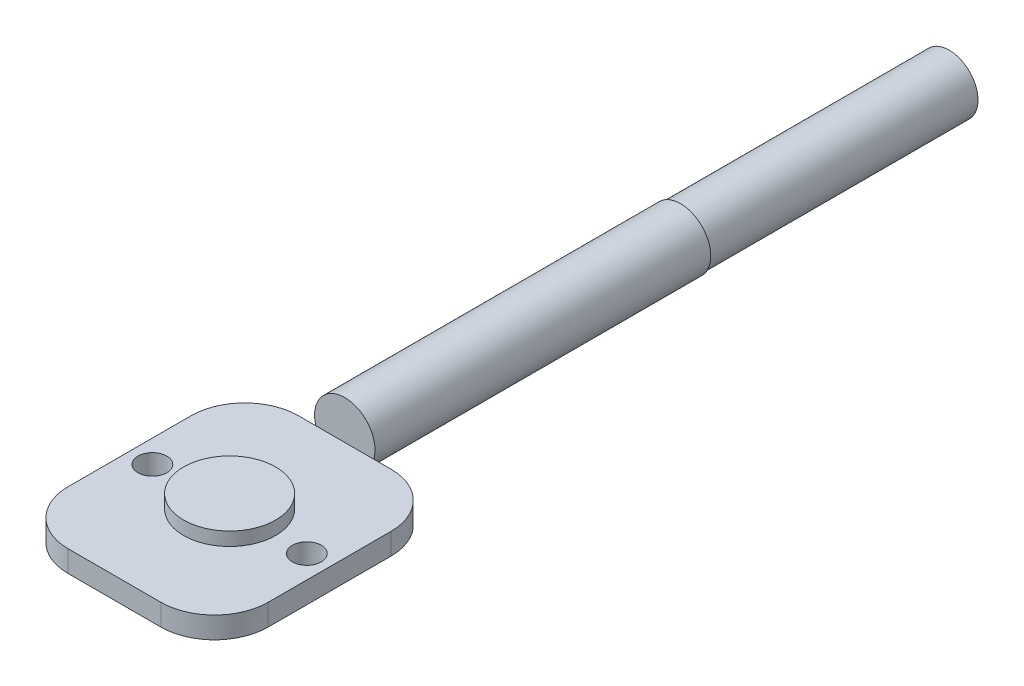
ISO-10303-21;
HEADER;
FILE_DESCRIPTION(('STEP AP214'),'2;1');
FILE_NAME('part.step','',(''),(''),'','','');
FILE_SCHEMA(('AUTOMOTIVE_DESIGN { 1 0 10303 214 1 1 1 1 }'));
ENDSEC;
DATA;
#1=APPLICATION_CONTEXT('core data for automotive mechanical design processes');
#2=APPLICATION_PROTOCOL_DEFINITION('international standard','automotive_design',2000,#1);
#3=PRODUCT_CONTEXT('',#1,'mechanical');
#4=PRODUCT('Part','Part','',(#3));
#5=PRODUCT_RELATED_PRODUCT_CATEGORY('part','',(#4));
#6=PRODUCT_DEFINITION_FORMATION('','',#4);
#7=PRODUCT_DEFINITION_CONTEXT('part definition',#1,'design');
#8=PRODUCT_DEFINITION('design','',#6,#7);
#9=PRODUCT_DEFINITION_SHAPE('','',#8);
#10=(LENGTH_UNIT() NAMED_UNIT(*) SI_UNIT(.MILLI.,.METRE.));
#11=(NAMED_UNIT(*) PLANE_ANGLE_UNIT() SI_UNIT($,.RADIAN.));
#12=(NAMED_UNIT(*) SI_UNIT($,.STERADIAN.) SOLID_ANGLE_UNIT());
#13=UNCERTAINTY_MEASURE_WITH_UNIT(LENGTH_MEASURE(1.E-05),#10,'distance_accuracy_value','');
#14=(GEOMETRIC_REPRESENTATION_CONTEXT(3) GLOBAL_UNCERTAINTY_ASSIGNED_CONTEXT((#13)) GLOBAL_UNIT_ASSIGNED_CONTEXT((#10,
#11,#12)) REPRESENTATION_CONTEXT('',''));
#15=CARTESIAN_POINT('',(0.,0.,0.));
#16=DIRECTION('',(0.,0.,1.));
#17=DIRECTION('',(1.,0.,0.));
#18=AXIS2_PLACEMENT_3D('',#15,#16,#17);
#19=CARTESIAN_POINT('',(0.,2.25,-33.575));
#20=DIRECTION('',(0.,0.,1.));
#21=DIRECTION('',(1.,0.,0.));
#22=AXIS2_PLACEMENT_3D('',#19,#20,#21);
#23=CYLINDRICAL_SURFACE('',#22,2.25);
#24=CARTESIAN_POINT('',(0.,2.25,-33.575));
#25=DIRECTION('',(0.,0.,-1.));
#26=DIRECTION('',(-1.,0.,0.));
#27=AXIS2_PLACEMENT_3D('',#24,#25,#26);
#28=CIRCLE('',#27,2.25);
#29=CARTESIAN_POINT('',(-2.25,2.25,-33.575));
#30=VERTEX_POINT('',#29);
#31=EDGE_CURVE('E56',#30,#30,#28,.T.);
#32=ORIENTED_EDGE('',*,*,#31,.F.);
#33=EDGE_LOOP('',(#32));
#34=FACE_BOUND('',#33,.T.);
#35=CARTESIAN_POINT('',(0.,2.25,-8.575));
#36=DIRECTION('',(0.,0.,-1.));
#37=DIRECTION('',(-1.,0.,0.));
#38=AXIS2_PLACEMENT_3D('',#35,#36,#37);
#39=CIRCLE('',#38,2.25);
#40=CARTESIAN_POINT('',(-2.25,2.25,-8.575));
#41=VERTEX_POINT('',#40);
#42=EDGE_CURVE('E52',#41,#41,#39,.T.);
#43=ORIENTED_EDGE('',*,*,#42,.T.);
#44=EDGE_LOOP('',(#43));
#45=FACE_BOUND('',#44,.T.);
#46=ADVANCED_FACE('F49',(#34,#45),#23,.T.);
#47=CARTESIAN_POINT('',(0.,2.25,-33.575));
#48=DIRECTION('',(0.,0.,-1.));
#49=DIRECTION('',(-1.,0.,0.));
#50=AXIS2_PLACEMENT_3D('',#47,#48,#49);
#51=PLANE('',#50);
#52=CARTESIAN_POINT('',(0.,2.25,-33.575));
#53=DIRECTION('',(0.,0.,-1.));
#54=DIRECTION('',(-1.,0.,0.));
#55=AXIS2_PLACEMENT_3D('',#52,#53,#54);
#56=CIRCLE('',#55,2.15);
#57=CARTESIAN_POINT('',(-2.15,2.25,-33.575));
#58=VERTEX_POINT('',#57);
#59=EDGE_CURVE('E11',#58,#58,#56,.T.);
#60=ORIENTED_EDGE('',*,*,#59,.F.);
#61=EDGE_LOOP('',(#60));
#62=FACE_BOUND('',#61,.T.);
#63=ORIENTED_EDGE('',*,*,#31,.T.);
#64=EDGE_LOOP('',(#63));
#65=FACE_BOUND('',#64,.T.);
#66=ADVANCED_FACE('F73',(#62,#65),#51,.T.);
#67=CARTESIAN_POINT('',(0.,2.25,-8.575));
#68=DIRECTION('',(0.,0.,-1.));
#69=DIRECTION('',(-1.,0.,0.));
#70=AXIS2_PLACEMENT_3D('',#67,#68,#69);
#71=PLANE('',#70);
#72=ORIENTED_EDGE('',*,*,#42,.F.);
#73=EDGE_LOOP('',(#72));
#74=FACE_BOUND('',#73,.T.);
#75=ADVANCED_FACE('F70',(#74),#71,.F.);
#76=CARTESIAN_POINT('',(0.,2.25,-53.575));
#77=DIRECTION('',(0.,0.,1.));
#78=DIRECTION('',(1.,0.,0.));
#79=AXIS2_PLACEMENT_3D('',#76,#77,#78);
#80=CYLINDRICAL_SURFACE('',#79,2.15);
#81=CARTESIAN_POINT('',(0.,2.25,-53.575));
#82=DIRECTION('',(0.,0.,-1.));
#83=DIRECTION('',(-1.,0.,0.));
#84=AXIS2_PLACEMENT_3D('',#81,#82,#83);
#85=CIRCLE('',#84,2.15);
#86=CARTESIAN_POINT('',(-2.15,2.25,-53.575));
#87=VERTEX_POINT('',#86);
#88=EDGE_CURVE('E62',#87,#87,#85,.T.);
#89=ORIENTED_EDGE('',*,*,#88,.F.);
#90=EDGE_LOOP('',(#89));
#91=FACE_BOUND('',#90,.T.);
#92=ORIENTED_EDGE('',*,*,#59,.T.);
#93=EDGE_LOOP('',(#92));
#94=FACE_BOUND('',#93,.T.);
#95=ADVANCED_FACE('F72',(#91,#94),#80,.T.);
#96=CARTESIAN_POINT('',(0.,2.25,-53.575));
#97=DIRECTION('',(0.,0.,-1.));
#98=DIRECTION('',(-1.,0.,0.));
#99=AXIS2_PLACEMENT_3D('',#96,#97,#98);
#100=PLANE('',#99);
#101=ORIENTED_EDGE('',*,*,#88,.T.);
#102=EDGE_LOOP('',(#101));
#103=FACE_BOUND('',#102,.T.);
#104=ADVANCED_FACE('F78',(#103),#100,.T.);
#105=CLOSED_SHELL('',(#46,#66,#75,#95,#104));
#106=MANIFOLD_SOLID_BREP('B2',#105);
#107=CARTESIAN_POINT('',(-3.45,1.6,4.57500000000001));
#108=DIRECTION('',(0.,-1.,0.));
#109=DIRECTION('',(0.,0.,-1.));
#110=AXIS2_PLACEMENT_3D('',#107,#108,#109);
#111=PLANE('',#110);
#112=CARTESIAN_POINT('',(0.,1.6,0.));
#113=DIRECTION('',(0.,1.,0.));
#114=DIRECTION('',(0.,0.,1.));
#115=AXIS2_PLACEMENT_3D('',#112,#113,#114);
#116=CIRCLE('',#115,3.42647578680288);
#117=CARTESIAN_POINT('',(0.,1.6,3.42647578680288));
#118=VERTEX_POINT('',#117);
#119=EDGE_CURVE('E47',#118,#118,#116,.T.);
#120=ORIENTED_EDGE('',*,*,#119,.F.);
#121=EDGE_LOOP('',(#120));
#122=FACE_BOUND('',#121,.T.);
#123=CARTESIAN_POINT('',(-3.45,1.6,4.57500000000001));
#124=DIRECTION('',(0.,1.,0.));
#125=DIRECTION('',(0.,0.,-1.));
#126=AXIS2_PLACEMENT_3D('',#123,#124,#125);
#127=CIRCLE('',#126,4.);
#128=CARTESIAN_POINT('',(-7.45,1.6,4.57500000000001));
#129=VERTEX_POINT('',#128);
#130=CARTESIAN_POINT('',(-3.45,1.6,8.57500000000001));
#131=VERTEX_POINT('',#130);
#132=EDGE_CURVE('E244',#129,#131,#127,.T.);
#133=ORIENTED_EDGE('',*,*,#132,.T.);
#134=DIRECTION('',(1.,0.,0.));
#135=VECTOR('',#134,1.);
#136=CARTESIAN_POINT('',(3.45,1.6,8.575));
#137=LINE('',#136,#135);
#138=CARTESIAN_POINT('',(3.45,1.6,8.575));
#139=VERTEX_POINT('',#138);
#140=EDGE_CURVE('E192',#131,#139,#137,.T.);
#141=ORIENTED_EDGE('',*,*,#140,.T.);
#142=CARTESIAN_POINT('',(3.45,1.6,4.575));
#143=DIRECTION('',(0.,1.,0.));
#144=DIRECTION('',(0.,0.,-1.));
#145=AXIS2_PLACEMENT_3D('',#142,#143,#144);
#146=CIRCLE('',#145,4.);
#147=CARTESIAN_POINT('',(7.45,1.6,4.575));
#148=VERTEX_POINT('',#147);
#149=EDGE_CURVE('E275',#139,#148,#146,.T.);
#150=ORIENTED_EDGE('',*,*,#149,.T.);
#151=DIRECTION('',(0.,0.,-1.));
#152=VECTOR('',#151,1.);
#153=CARTESIAN_POINT('',(7.45,1.6,-4.575));
#154=LINE('',#153,#152);
#155=CARTESIAN_POINT('',(7.45,1.6,-4.575));
#156=VERTEX_POINT('',#155);
#157=EDGE_CURVE('E274',#148,#156,#154,.T.);
#158=ORIENTED_EDGE('',*,*,#157,.T.);
#159=CARTESIAN_POINT('',(3.45,1.6,-4.575));
#160=DIRECTION('',(0.,1.,0.));
#161=DIRECTION('',(0.,0.,1.));
#162=AXIS2_PLACEMENT_3D('',#159,#160,#161);
#163=CIRCLE('',#162,4.);
#164=CARTESIAN_POINT('',(3.45,1.6,-8.575));
#165=VERTEX_POINT('',#164);
#166=EDGE_CURVE('E211',#156,#165,#163,.T.);
#167=ORIENTED_EDGE('',*,*,#166,.T.);
#168=DIRECTION('',(-1.,0.,0.));
#169=VECTOR('',#168,1.);
#170=CARTESIAN_POINT('',(-3.45,1.6,-8.575));
#171=LINE('',#170,#169);
#172=CARTESIAN_POINT('',(-3.45,1.6,-8.575));
#173=VERTEX_POINT('',#172);
#174=EDGE_CURVE('E205',#165,#173,#171,.T.);
#175=ORIENTED_EDGE('',*,*,#174,.T.);
#176=CARTESIAN_POINT('',(-3.45,1.6,-4.575));
#177=DIRECTION('',(0.,1.,0.));
#178=DIRECTION('',(0.,0.,1.));
#179=AXIS2_PLACEMENT_3D('',#176,#177,#178);
#180=CIRCLE('',#179,4.);
#181=CARTESIAN_POINT('',(-7.45,1.6,-4.575));
#182=VERTEX_POINT('',#181);
#183=EDGE_CURVE('E209',#173,#182,#180,.T.);
#184=ORIENTED_EDGE('',*,*,#183,.T.);
#185=DIRECTION('',(0.,0.,1.));
#186=VECTOR('',#185,1.);
#187=CARTESIAN_POINT('',(-7.45,1.6,4.57500000000001));
#188=LINE('',#187,#186);
#189=EDGE_CURVE('E148',#182,#129,#188,.T.);
#190=ORIENTED_EDGE('',*,*,#189,.T.);
#191=EDGE_LOOP('',(#133,#141,#150,#158,#167,#175,#184,#190));
#192=FACE_BOUND('',#191,.T.);
#193=CARTESIAN_POINT('',(-5.75,1.6,0.));
#194=DIRECTION('',(0.,1.,0.));
#195=DIRECTION('',(0.,0.,1.));
#196=AXIS2_PLACEMENT_3D('',#193,#194,#195);
#197=CIRCLE('',#196,1.075);
#198=CARTESIAN_POINT('',(-5.75,1.6,1.075));
#199=VERTEX_POINT('',#198);
#200=EDGE_CURVE('E233',#199,#199,#197,.T.);
#201=ORIENTED_EDGE('',*,*,#200,.F.);
#202=EDGE_LOOP('',(#201));
#203=FACE_BOUND('',#202,.T.);
#204=CARTESIAN_POINT('',(5.75,1.6,0.));
#205=DIRECTION('',(0.,1.,0.));
#206=DIRECTION('',(0.,0.,1.));
#207=AXIS2_PLACEMENT_3D('',#204,#205,#206);
#208=CIRCLE('',#207,1.075);
#209=CARTESIAN_POINT('',(5.75,1.6,1.075));
#210=VERTEX_POINT('',#209);
#211=EDGE_CURVE('E284',#210,#210,#208,.T.);
#212=ORIENTED_EDGE('',*,*,#211,.F.);
#213=EDGE_LOOP('',(#212));
#214=FACE_BOUND('',#213,.T.);
#215=ADVANCED_FACE('F130',(#122,#192,#203,#214),#111,.F.);
#216=CARTESIAN_POINT('',(-3.45,0.,4.57500000000001));
#217=DIRECTION('',(0.,-1.,0.));
#218=DIRECTION('',(0.,0.,-1.));
#219=AXIS2_PLACEMENT_3D('',#216,#217,#218);
#220=PLANE('',#219);
#221=CARTESIAN_POINT('',(-5.75,0.,0.));
#222=DIRECTION('',(0.,1.,0.));
#223=DIRECTION('',(0.,0.,1.));
#224=AXIS2_PLACEMENT_3D('',#221,#222,#223);
#225=CIRCLE('',#224,1.075);
#226=CARTESIAN_POINT('',(-5.75,0.,1.075));
#227=VERTEX_POINT('',#226);
#228=EDGE_CURVE('E281',#227,#227,#225,.T.);
#229=ORIENTED_EDGE('',*,*,#228,.T.);
#230=EDGE_LOOP('',(#229));
#231=FACE_BOUND('',#230,.T.);
#232=CARTESIAN_POINT('',(-3.45,0.,4.57500000000001));
#233=DIRECTION('',(0.,1.,0.));
#234=DIRECTION('',(0.,0.,-1.));
#235=AXIS2_PLACEMENT_3D('',#232,#233,#234);
#236=CIRCLE('',#235,4.);
#237=CARTESIAN_POINT('',(-7.45,0.,4.57500000000001));
#238=VERTEX_POINT('',#237);
#239=CARTESIAN_POINT('',(-3.45,0.,8.57500000000001));
#240=VERTEX_POINT('',#239);
#241=EDGE_CURVE('E229',#238,#240,#236,.T.);
#242=ORIENTED_EDGE('',*,*,#241,.F.);
#243=DIRECTION('',(0.,0.,1.));
#244=VECTOR('',#243,1.);
#245=CARTESIAN_POINT('',(-7.45,0.,4.57500000000001));
#246=LINE('',#245,#244);
#247=CARTESIAN_POINT('',(-7.45,0.,-4.575));
#248=VERTEX_POINT('',#247);
#249=EDGE_CURVE('E183',#248,#238,#246,.T.);
#250=ORIENTED_EDGE('',*,*,#249,.F.);
#251=CARTESIAN_POINT('',(-3.45,0.,-4.575));
#252=DIRECTION('',(0.,1.,0.));
#253=DIRECTION('',(0.,0.,1.));
#254=AXIS2_PLACEMENT_3D('',#251,#252,#253);
#255=CIRCLE('',#254,4.);
#256=CARTESIAN_POINT('',(-3.45,0.,-8.575));
#257=VERTEX_POINT('',#256);
#258=EDGE_CURVE('E177',#257,#248,#255,.T.);
#259=ORIENTED_EDGE('',*,*,#258,.F.);
#260=DIRECTION('',(-1.,0.,0.));
#261=VECTOR('',#260,1.);
#262=CARTESIAN_POINT('',(-3.45,0.,-8.575));
#263=LINE('',#262,#261);
#264=CARTESIAN_POINT('',(3.45,0.,-8.575));
#265=VERTEX_POINT('',#264);
#266=EDGE_CURVE('E219',#265,#257,#263,.T.);
#267=ORIENTED_EDGE('',*,*,#266,.F.);
#268=CARTESIAN_POINT('',(3.45,0.,-4.575));
#269=DIRECTION('',(0.,1.,0.));
#270=DIRECTION('',(0.,0.,1.));
#271=AXIS2_PLACEMENT_3D('',#268,#269,#270);
#272=CIRCLE('',#271,4.);
#273=CARTESIAN_POINT('',(7.45,0.,-4.575));
#274=VERTEX_POINT('',#273);
#275=EDGE_CURVE('E239',#274,#265,#272,.T.);
#276=ORIENTED_EDGE('',*,*,#275,.F.);
#277=DIRECTION('',(0.,0.,-1.));
#278=VECTOR('',#277,1.);
#279=CARTESIAN_POINT('',(7.45,0.,-4.575));
#280=LINE('',#279,#278);
#281=CARTESIAN_POINT('',(7.45,0.,4.575));
#282=VERTEX_POINT('',#281);
#283=EDGE_CURVE('E237',#282,#274,#280,.T.);
#284=ORIENTED_EDGE('',*,*,#283,.F.);
#285=CARTESIAN_POINT('',(3.45,0.,4.575));
#286=DIRECTION('',(0.,1.,0.));
#287=DIRECTION('',(0.,0.,-1.));
#288=AXIS2_PLACEMENT_3D('',#285,#286,#287);
#289=CIRCLE('',#288,4.);
#290=CARTESIAN_POINT('',(3.45,0.,8.575));
#291=VERTEX_POINT('',#290);
#292=EDGE_CURVE('E235',#291,#282,#289,.T.);
#293=ORIENTED_EDGE('',*,*,#292,.F.);
#294=DIRECTION('',(1.,0.,0.));
#295=VECTOR('',#294,1.);
#296=CARTESIAN_POINT('',(3.45,0.,8.575));
#297=LINE('',#296,#295);
#298=EDGE_CURVE('E232',#240,#291,#297,.T.);
#299=ORIENTED_EDGE('',*,*,#298,.F.);
#300=EDGE_LOOP('',(#242,#250,#259,#267,#276,#284,#293,#299));
#301=FACE_BOUND('',#300,.T.);
#302=CARTESIAN_POINT('',(5.75,0.,0.));
#303=DIRECTION('',(0.,1.,0.));
#304=DIRECTION('',(0.,0.,1.));
#305=AXIS2_PLACEMENT_3D('',#302,#303,#304);
#306=CIRCLE('',#305,1.075);
#307=CARTESIAN_POINT('',(5.75,0.,1.075));
#308=VERTEX_POINT('',#307);
#309=EDGE_CURVE('E287',#308,#308,#306,.T.);
#310=ORIENTED_EDGE('',*,*,#309,.T.);
#311=EDGE_LOOP('',(#310));
#312=FACE_BOUND('',#311,.T.);
#313=ADVANCED_FACE('F264',(#231,#301,#312),#220,.T.);
#314=CARTESIAN_POINT('',(-3.45,1.6,4.57500000000001));
#315=DIRECTION('',(0.,-1.,0.));
#316=DIRECTION('',(0.,0.,-1.));
#317=AXIS2_PLACEMENT_3D('',#314,#315,#316);
#318=CYLINDRICAL_SURFACE('',#317,4.);
#319=ORIENTED_EDGE('',*,*,#241,.T.);
#320=DIRECTION('',(0.,-1.,0.));
#321=VECTOR('',#320,1.);
#322=CARTESIAN_POINT('',(-3.45,1.6,8.57500000000001));
#323=LINE('',#322,#321);
#324=EDGE_CURVE('E134',#131,#240,#323,.T.);
#325=ORIENTED_EDGE('',*,*,#324,.F.);
#326=ORIENTED_EDGE('',*,*,#132,.F.);
#327=DIRECTION('',(0.,-1.,0.));
#328=VECTOR('',#327,1.);
#329=CARTESIAN_POINT('',(-7.45,1.6,4.57500000000001));
#330=LINE('',#329,#328);
#331=EDGE_CURVE('E225',#129,#238,#330,.T.);
#332=ORIENTED_EDGE('',*,*,#331,.T.);
#333=EDGE_LOOP('',(#319,#325,#326,#332));
#334=FACE_BOUND('',#333,.T.);
#335=ADVANCED_FACE('F132',(#334),#318,.T.);
#336=CARTESIAN_POINT('',(3.45,1.6,8.575));
#337=DIRECTION('',(0.,0.,-1.));
#338=DIRECTION('',(-1.,0.,0.));
#339=AXIS2_PLACEMENT_3D('',#336,#337,#338);
#340=PLANE('',#339);
#341=ORIENTED_EDGE('',*,*,#298,.T.);
#342=DIRECTION('',(0.,-1.,0.));
#343=VECTOR('',#342,1.);
#344=CARTESIAN_POINT('',(3.45,1.6,8.575));
#345=LINE('',#344,#343);
#346=EDGE_CURVE('E253',#139,#291,#345,.T.);
#347=ORIENTED_EDGE('',*,*,#346,.F.);
#348=ORIENTED_EDGE('',*,*,#140,.F.);
#349=ORIENTED_EDGE('',*,*,#324,.T.);
#350=EDGE_LOOP('',(#341,#347,#348,#349));
#351=FACE_BOUND('',#350,.T.);
#352=ADVANCED_FACE('F259',(#351),#340,.F.);
#353=CARTESIAN_POINT('',(3.45,1.6,4.575));
#354=DIRECTION('',(0.,-1.,0.));
#355=DIRECTION('',(0.,0.,-1.));
#356=AXIS2_PLACEMENT_3D('',#353,#354,#355);
#357=CYLINDRICAL_SURFACE('',#356,4.);
#358=ORIENTED_EDGE('',*,*,#292,.T.);
#359=DIRECTION('',(0.,-1.,0.));
#360=VECTOR('',#359,1.);
#361=CARTESIAN_POINT('',(7.45,1.6,4.575));
#362=LINE('',#361,#360);
#363=EDGE_CURVE('E251',#148,#282,#362,.T.);
#364=ORIENTED_EDGE('',*,*,#363,.F.);
#365=ORIENTED_EDGE('',*,*,#149,.F.);
#366=ORIENTED_EDGE('',*,*,#346,.T.);
#367=EDGE_LOOP('',(#358,#364,#365,#366));
#368=FACE_BOUND('',#367,.T.);
#369=ADVANCED_FACE('F269',(#368),#357,.T.);
#370=CARTESIAN_POINT('',(7.45,1.6,-4.575));
#371=DIRECTION('',(-1.,0.,0.));
#372=DIRECTION('',(0.,0.,1.));
#373=AXIS2_PLACEMENT_3D('',#370,#371,#372);
#374=PLANE('',#373);
#375=ORIENTED_EDGE('',*,*,#283,.T.);
#376=DIRECTION('',(0.,-1.,0.));
#377=VECTOR('',#376,1.);
#378=CARTESIAN_POINT('',(7.45,1.6,-4.575));
#379=LINE('',#378,#377);
#380=EDGE_CURVE('E248',#156,#274,#379,.T.);
#381=ORIENTED_EDGE('',*,*,#380,.F.);
#382=ORIENTED_EDGE('',*,*,#157,.F.);
#383=ORIENTED_EDGE('',*,*,#363,.T.);
#384=EDGE_LOOP('',(#375,#381,#382,#383));
#385=FACE_BOUND('',#384,.T.);
#386=ADVANCED_FACE('F272',(#385),#374,.F.);
#387=CARTESIAN_POINT('',(3.45,1.6,-4.575));
#388=DIRECTION('',(0.,-1.,0.));
#389=DIRECTION('',(0.,0.,-1.));
#390=AXIS2_PLACEMENT_3D('',#387,#388,#389);
#391=CYLINDRICAL_SURFACE('',#390,4.);
#392=ORIENTED_EDGE('',*,*,#275,.T.);
#393=DIRECTION('',(0.,-1.,0.));
#394=VECTOR('',#393,1.);
#395=CARTESIAN_POINT('',(3.45,1.6,-8.575));
#396=LINE('',#395,#394);
#397=EDGE_CURVE('E220',#165,#265,#396,.T.);
#398=ORIENTED_EDGE('',*,*,#397,.F.);
#399=ORIENTED_EDGE('',*,*,#166,.F.);
#400=ORIENTED_EDGE('',*,*,#380,.T.);
#401=EDGE_LOOP('',(#392,#398,#399,#400));
#402=FACE_BOUND('',#401,.T.);
#403=ADVANCED_FACE('F323',(#402),#391,.T.);
#404=CARTESIAN_POINT('',(-3.45,1.6,-8.575));
#405=DIRECTION('',(0.,0.,1.));
#406=DIRECTION('',(1.,0.,0.));
#407=AXIS2_PLACEMENT_3D('',#404,#405,#406);
#408=PLANE('',#407);
#409=ORIENTED_EDGE('',*,*,#266,.T.);
#410=DIRECTION('',(0.,-1.,0.));
#411=VECTOR('',#410,1.);
#412=CARTESIAN_POINT('',(-3.45,1.6,-8.575));
#413=LINE('',#412,#411);
#414=EDGE_CURVE('E216',#173,#257,#413,.T.);
#415=ORIENTED_EDGE('',*,*,#414,.F.);
#416=ORIENTED_EDGE('',*,*,#174,.F.);
#417=ORIENTED_EDGE('',*,*,#397,.T.);
#418=EDGE_LOOP('',(#409,#415,#416,#417));
#419=FACE_BOUND('',#418,.T.);
#420=ADVANCED_FACE('F217',(#419),#408,.F.);
#421=CARTESIAN_POINT('',(-3.45,1.6,-4.575));
#422=DIRECTION('',(0.,-1.,0.));
#423=DIRECTION('',(0.,0.,-1.));
#424=AXIS2_PLACEMENT_3D('',#421,#422,#423);
#425=CYLINDRICAL_SURFACE('',#424,4.);
#426=ORIENTED_EDGE('',*,*,#258,.T.);
#427=DIRECTION('',(0.,-1.,0.));
#428=VECTOR('',#427,1.);
#429=CARTESIAN_POINT('',(-7.45,1.6,-4.575));
#430=LINE('',#429,#428);
#431=EDGE_CURVE('E221',#182,#248,#430,.T.);
#432=ORIENTED_EDGE('',*,*,#431,.F.);
#433=ORIENTED_EDGE('',*,*,#183,.F.);
#434=ORIENTED_EDGE('',*,*,#414,.T.);
#435=EDGE_LOOP('',(#426,#432,#433,#434));
#436=FACE_BOUND('',#435,.T.);
#437=ADVANCED_FACE('F223',(#436),#425,.T.);
#438=CARTESIAN_POINT('',(-7.45,1.6,4.57500000000001));
#439=DIRECTION('',(1.,0.,0.));
#440=DIRECTION('',(0.,0.,-1.));
#441=AXIS2_PLACEMENT_3D('',#438,#439,#440);
#442=PLANE('',#441);
#443=ORIENTED_EDGE('',*,*,#249,.T.);
#444=ORIENTED_EDGE('',*,*,#331,.F.);
#445=ORIENTED_EDGE('',*,*,#189,.F.);
#446=ORIENTED_EDGE('',*,*,#431,.T.);
#447=EDGE_LOOP('',(#443,#444,#445,#446));
#448=FACE_BOUND('',#447,.T.);
#449=ADVANCED_FACE('F316',(#448),#442,.F.);
#450=CARTESIAN_POINT('',(-5.75,1.6,0.));
#451=DIRECTION('',(0.,-1.,0.));
#452=DIRECTION('',(0.,0.,-1.));
#453=AXIS2_PLACEMENT_3D('',#450,#451,#452);
#454=CYLINDRICAL_SURFACE('',#453,1.075);
#455=ORIENTED_EDGE('',*,*,#200,.T.);
#456=EDGE_LOOP('',(#455));
#457=FACE_BOUND('',#456,.T.);
#458=ORIENTED_EDGE('',*,*,#228,.F.);
#459=EDGE_LOOP('',(#458));
#460=FACE_BOUND('',#459,.T.);
#461=ADVANCED_FACE('F313',(#457,#460),#454,.F.);
#462=CARTESIAN_POINT('',(5.75,1.6,0.));
#463=DIRECTION('',(0.,-1.,0.));
#464=DIRECTION('',(0.,0.,-1.));
#465=AXIS2_PLACEMENT_3D('',#462,#463,#464);
#466=CYLINDRICAL_SURFACE('',#465,1.075);
#467=ORIENTED_EDGE('',*,*,#211,.T.);
#468=EDGE_LOOP('',(#467));
#469=FACE_BOUND('',#468,.T.);
#470=ORIENTED_EDGE('',*,*,#309,.F.);
#471=EDGE_LOOP('',(#470));
#472=FACE_BOUND('',#471,.T.);
#473=ADVANCED_FACE('F301',(#469,#472),#466,.F.);
#474=CARTESIAN_POINT('',(0.,2.6,0.));
#475=DIRECTION('',(0.,-1.,0.));
#476=DIRECTION('',(0.,0.,-1.));
#477=AXIS2_PLACEMENT_3D('',#474,#475,#476);
#478=CYLINDRICAL_SURFACE('',#477,3.42647578680288);
#479=CARTESIAN_POINT('',(0.,2.6,0.));
#480=DIRECTION('',(0.,1.,0.));
#481=DIRECTION('',(0.,0.,1.));
#482=AXIS2_PLACEMENT_3D('',#479,#480,#481);
#483=CIRCLE('',#482,3.42647578680288);
#484=CARTESIAN_POINT('',(0.,2.6,3.42647578680288));
#485=VERTEX_POINT('',#484);
#486=EDGE_CURVE('E290',#485,#485,#483,.T.);
#487=ORIENTED_EDGE('',*,*,#486,.F.);
#488=EDGE_LOOP('',(#487));
#489=FACE_BOUND('',#488,.T.);
#490=ORIENTED_EDGE('',*,*,#119,.T.);
#491=EDGE_LOOP('',(#490));
#492=FACE_BOUND('',#491,.T.);
#493=ADVANCED_FACE('F298',(#489,#492),#478,.T.);
#494=CARTESIAN_POINT('',(0.,2.6,0.));
#495=DIRECTION('',(0.,1.,0.));
#496=DIRECTION('',(0.,0.,1.));
#497=AXIS2_PLACEMENT_3D('',#494,#495,#496);
#498=PLANE('',#497);
#499=ORIENTED_EDGE('',*,*,#486,.T.);
#500=EDGE_LOOP('',(#499));
#501=FACE_BOUND('',#500,.T.);
#502=ADVANCED_FACE('F296',(#501),#498,.T.);
#503=CLOSED_SHELL('',(#215,#313,#335,#352,#369,#386,#403,#420,#437,#449,#461,#473,#493,#502));
#504=MANIFOLD_SOLID_BREP('B6',#503);
#505=ADVANCED_BREP_SHAPE_REPRESENTATION('',(#18,#106,#504),#14);
#506=SHAPE_DEFINITION_REPRESENTATION(#9,#505);
ENDSEC;
END-ISO-10303-21;
